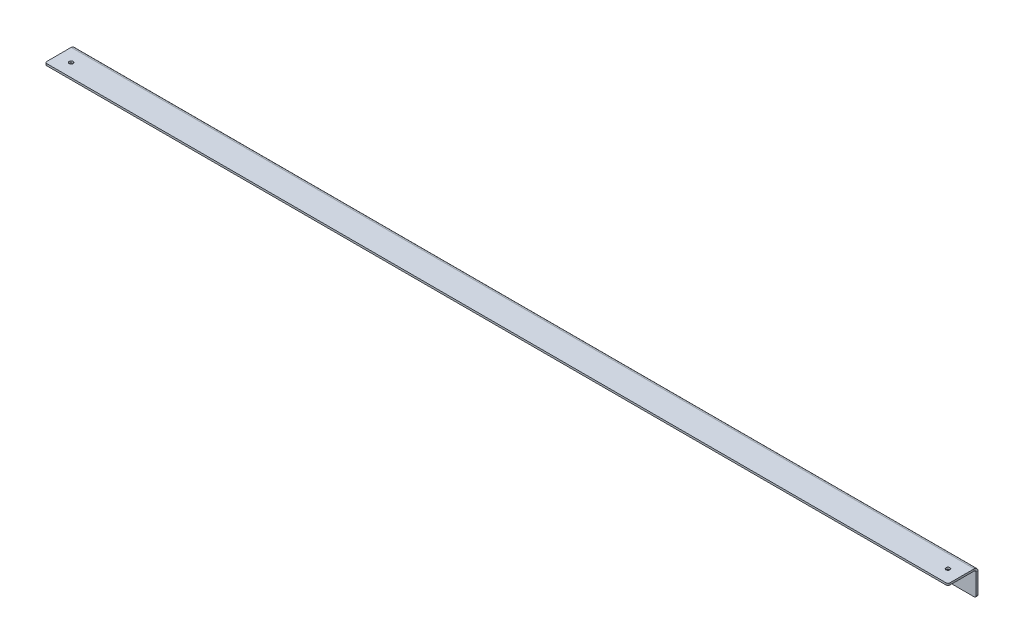
ISO-10303-21;
HEADER;
FILE_DESCRIPTION(('STEP AP214'),'2;1');
FILE_NAME('part.step','',(''),(''),'','','');
FILE_SCHEMA(('AUTOMOTIVE_DESIGN { 1 0 10303 214 1 1 1 1 }'));
ENDSEC;
DATA;
#1=APPLICATION_CONTEXT('core data for automotive mechanical design processes');
#2=APPLICATION_PROTOCOL_DEFINITION('international standard','automotive_design',2000,#1);
#3=PRODUCT_CONTEXT('',#1,'mechanical');
#4=PRODUCT('Part','Part','',(#3));
#5=PRODUCT_RELATED_PRODUCT_CATEGORY('part','',(#4));
#6=PRODUCT_DEFINITION_FORMATION('','',#4);
#7=PRODUCT_DEFINITION_CONTEXT('part definition',#1,'design');
#8=PRODUCT_DEFINITION('design','',#6,#7);
#9=PRODUCT_DEFINITION_SHAPE('','',#8);
#10=(LENGTH_UNIT() NAMED_UNIT(*) SI_UNIT(.MILLI.,.METRE.));
#11=(NAMED_UNIT(*) PLANE_ANGLE_UNIT() SI_UNIT($,.RADIAN.));
#12=(NAMED_UNIT(*) SI_UNIT($,.STERADIAN.) SOLID_ANGLE_UNIT());
#13=UNCERTAINTY_MEASURE_WITH_UNIT(LENGTH_MEASURE(1.E-05),#10,'distance_accuracy_value','');
#14=(GEOMETRIC_REPRESENTATION_CONTEXT(3) GLOBAL_UNCERTAINTY_ASSIGNED_CONTEXT((#13)) GLOBAL_UNIT_ASSIGNED_CONTEXT((#10,
#11,#12)) REPRESENTATION_CONTEXT('',''));
#15=CARTESIAN_POINT('',(0.,0.,0.));
#16=DIRECTION('',(0.,0.,1.));
#17=DIRECTION('',(1.,0.,0.));
#18=AXIS2_PLACEMENT_3D('',#15,#16,#17);
#19=CARTESIAN_POINT('',(0.,-3.2639,0.));
#20=DIRECTION('',(-1.,0.,0.));
#21=DIRECTION('',(0.,0.,1.));
#22=AXIS2_PLACEMENT_3D('',#19,#20,#21);
#23=PLANE('',#22);
#24=DIRECTION('',(0.,0.,1.));
#25=VECTOR('',#24,1.);
#26=CARTESIAN_POINT('',(0.,-3.2639,0.));
#27=LINE('',#26,#25);
#28=CARTESIAN_POINT('',(0.,-3.26390000000002,-44.45));
#29=VERTEX_POINT('',#28);
#30=CARTESIAN_POINT('',(0.,-3.2639,-3.175));
#31=VERTEX_POINT('',#30);
#32=EDGE_CURVE('E216',#29,#31,#27,.T.);
#33=ORIENTED_EDGE('',*,*,#32,.T.);
#34=DIRECTION('',(0.,1.,0.));
#35=VECTOR('',#34,1.);
#36=CARTESIAN_POINT('',(0.,-3.2639,-3.175));
#37=LINE('',#36,#35);
#38=CARTESIAN_POINT('',(0.,0.,-3.175));
#39=VERTEX_POINT('',#38);
#40=EDGE_CURVE('E264',#31,#39,#37,.T.);
#41=ORIENTED_EDGE('',*,*,#40,.T.);
#42=DIRECTION('',(0.,0.,1.));
#43=VECTOR('',#42,1.);
#44=CARTESIAN_POINT('',(0.,0.,0.));
#45=LINE('',#44,#43);
#46=CARTESIAN_POINT('',(0.,0.,-44.45));
#47=VERTEX_POINT('',#46);
#48=EDGE_CURVE('E209',#47,#39,#45,.T.);
#49=ORIENTED_EDGE('',*,*,#48,.F.);
#50=DIRECTION('',(0.,1.,0.));
#51=VECTOR('',#50,1.);
#52=CARTESIAN_POINT('',(0.,-3.2639,-44.45));
#53=LINE('',#52,#51);
#54=EDGE_CURVE('E242',#29,#47,#53,.T.);
#55=ORIENTED_EDGE('',*,*,#54,.F.);
#56=EDGE_LOOP('',(#33,#41,#49,#55));
#57=FACE_BOUND('',#56,.T.);
#58=ADVANCED_FACE('F60',(#57),#23,.T.);
#59=CARTESIAN_POINT('',(1530.35,-3.2639,0.));
#60=DIRECTION('',(1.,0.,0.));
#61=DIRECTION('',(0.,0.,-1.));
#62=AXIS2_PLACEMENT_3D('',#59,#60,#61);
#63=PLANE('',#62);
#64=DIRECTION('',(0.,0.,-1.));
#65=VECTOR('',#64,1.);
#66=CARTESIAN_POINT('',(1530.35,0.,0.));
#67=LINE('',#66,#65);
#68=CARTESIAN_POINT('',(1530.35,0.,-3.175));
#69=VERTEX_POINT('',#68);
#70=CARTESIAN_POINT('',(1530.35,0.,-44.45));
#71=VERTEX_POINT('',#70);
#72=EDGE_CURVE('E237',#69,#71,#67,.T.);
#73=ORIENTED_EDGE('',*,*,#72,.F.);
#74=DIRECTION('',(0.,1.,0.));
#75=VECTOR('',#74,1.);
#76=CARTESIAN_POINT('',(1530.35,-3.2639,-3.175));
#77=LINE('',#76,#75);
#78=CARTESIAN_POINT('',(1530.35,-3.2639,-3.175));
#79=VERTEX_POINT('',#78);
#80=EDGE_CURVE('E13',#69,#79,#77,.F.);
#81=ORIENTED_EDGE('',*,*,#80,.T.);
#82=DIRECTION('',(0.,0.,-1.));
#83=VECTOR('',#82,1.);
#84=CARTESIAN_POINT('',(1530.35,-3.2639,0.));
#85=LINE('',#84,#83);
#86=CARTESIAN_POINT('',(1530.35,-3.26390000000002,-44.45));
#87=VERTEX_POINT('',#86);
#88=EDGE_CURVE('E223',#79,#87,#85,.T.);
#89=ORIENTED_EDGE('',*,*,#88,.T.);
#90=DIRECTION('',(0.,1.,0.));
#91=VECTOR('',#90,1.);
#92=CARTESIAN_POINT('',(1530.35,-3.2639,-44.45));
#93=LINE('',#92,#91);
#94=EDGE_CURVE('E229',#87,#71,#93,.T.);
#95=ORIENTED_EDGE('',*,*,#94,.T.);
#96=EDGE_LOOP('',(#73,#81,#89,#95));
#97=FACE_BOUND('',#96,.T.);
#98=ADVANCED_FACE('F296',(#97),#63,.T.);
#99=CARTESIAN_POINT('',(0.,-3.2639,0.));
#100=DIRECTION('',(0.,0.,1.));
#101=DIRECTION('',(1.,0.,0.));
#102=AXIS2_PLACEMENT_3D('',#99,#100,#101);
#103=PLANE('',#102);
#104=DIRECTION('',(1.,0.,0.));
#105=VECTOR('',#104,1.);
#106=CARTESIAN_POINT('',(0.,0.,0.));
#107=LINE('',#106,#105);
#108=CARTESIAN_POINT('',(3.175,0.,0.));
#109=VERTEX_POINT('',#108);
#110=CARTESIAN_POINT('',(1527.175,0.,0.));
#111=VERTEX_POINT('',#110);
#112=EDGE_CURVE('E233',#109,#111,#107,.T.);
#113=ORIENTED_EDGE('',*,*,#112,.F.);
#114=DIRECTION('',(0.,1.,0.));
#115=VECTOR('',#114,1.);
#116=CARTESIAN_POINT('',(3.175,-3.2639,0.));
#117=LINE('',#116,#115);
#118=CARTESIAN_POINT('',(3.175,-3.2639,0.));
#119=VERTEX_POINT('',#118);
#120=EDGE_CURVE('E274',#109,#119,#117,.F.);
#121=ORIENTED_EDGE('',*,*,#120,.T.);
#122=DIRECTION('',(1.,0.,0.));
#123=VECTOR('',#122,1.);
#124=CARTESIAN_POINT('',(0.,-3.2639,0.));
#125=LINE('',#124,#123);
#126=CARTESIAN_POINT('',(1527.175,-3.2639,0.));
#127=VERTEX_POINT('',#126);
#128=EDGE_CURVE('E220',#119,#127,#125,.T.);
#129=ORIENTED_EDGE('',*,*,#128,.T.);
#130=DIRECTION('',(0.,1.,0.));
#131=VECTOR('',#130,1.);
#132=CARTESIAN_POINT('',(1527.175,-3.2639,0.));
#133=LINE('',#132,#131);
#134=EDGE_CURVE('E271',#127,#111,#133,.T.);
#135=ORIENTED_EDGE('',*,*,#134,.T.);
#136=EDGE_LOOP('',(#113,#121,#129,#135));
#137=FACE_BOUND('',#136,.T.);
#138=ADVANCED_FACE('F293',(#137),#103,.T.);
#139=CARTESIAN_POINT('',(0.,-3.2639,0.));
#140=DIRECTION('',(0.,-1.,0.));
#141=DIRECTION('',(0.,0.,-1.));
#142=AXIS2_PLACEMENT_3D('',#139,#140,#141);
#143=PLANE('',#142);
#144=CARTESIAN_POINT('',(22.2249999999999,-3.2639,-22.225));
#145=DIRECTION('',(0.,-1.,0.));
#146=DIRECTION('',(0.,0.,-1.));
#147=AXIS2_PLACEMENT_3D('',#144,#145,#146);
#148=CIRCLE('',#147,3.37819999999999);
#149=CARTESIAN_POINT('',(22.2249999999999,-3.2639,-25.6032));
#150=VERTEX_POINT('',#149);
#151=EDGE_CURVE('E335',#150,#150,#148,.T.);
#152=ORIENTED_EDGE('',*,*,#151,.F.);
#153=EDGE_LOOP('',(#152));
#154=FACE_BOUND('',#153,.T.);
#155=CARTESIAN_POINT('',(1508.125,-3.2639,-22.225));
#156=DIRECTION('',(0.,-1.,0.));
#157=DIRECTION('',(0.,0.,-1.));
#158=AXIS2_PLACEMENT_3D('',#155,#156,#157);
#159=CIRCLE('',#158,3.3782);
#160=CARTESIAN_POINT('',(1508.125,-3.2639,-25.6032));
#161=VERTEX_POINT('',#160);
#162=EDGE_CURVE('E207',#161,#161,#159,.T.);
#163=ORIENTED_EDGE('',*,*,#162,.F.);
#164=EDGE_LOOP('',(#163));
#165=FACE_BOUND('',#164,.T.);
#166=ORIENTED_EDGE('',*,*,#128,.F.);
#167=CARTESIAN_POINT('',(3.175,-3.2639,-3.175));
#168=DIRECTION('',(0.,-1.,0.));
#169=DIRECTION('',(0.,0.,-1.));
#170=AXIS2_PLACEMENT_3D('',#167,#168,#169);
#171=CIRCLE('',#170,3.175);
#172=EDGE_CURVE('E277',#119,#31,#171,.T.);
#173=ORIENTED_EDGE('',*,*,#172,.T.);
#174=ORIENTED_EDGE('',*,*,#32,.F.);
#175=DIRECTION('',(-1.,0.,0.));
#176=VECTOR('',#175,1.);
#177=CARTESIAN_POINT('',(0.,-3.2639,-44.45));
#178=LINE('',#177,#176);
#179=EDGE_CURVE('E226',#87,#29,#178,.T.);
#180=ORIENTED_EDGE('',*,*,#179,.F.);
#181=ORIENTED_EDGE('',*,*,#88,.F.);
#182=CARTESIAN_POINT('',(1527.175,-3.2639,-3.175));
#183=DIRECTION('',(0.,-1.,0.));
#184=DIRECTION('',(0.,0.,-1.));
#185=AXIS2_PLACEMENT_3D('',#182,#183,#184);
#186=CIRCLE('',#185,3.175);
#187=EDGE_CURVE('E80',#79,#127,#186,.T.);
#188=ORIENTED_EDGE('',*,*,#187,.T.);
#189=EDGE_LOOP('',(#166,#173,#174,#180,#181,#188));
#190=FACE_BOUND('',#189,.T.);
#191=ADVANCED_FACE('F280',(#154,#165,#190),#143,.T.);
#192=CARTESIAN_POINT('',(0.,0.,0.));
#193=DIRECTION('',(0.,-1.,0.));
#194=DIRECTION('',(0.,0.,-1.));
#195=AXIS2_PLACEMENT_3D('',#192,#193,#194);
#196=PLANE('',#195);
#197=CARTESIAN_POINT('',(22.2249999999999,0.,-22.225));
#198=DIRECTION('',(0.,1.,0.));
#199=DIRECTION('',(0.,0.,1.));
#200=AXIS2_PLACEMENT_3D('',#197,#198,#199);
#201=CIRCLE('',#200,3.37819999999999);
#202=CARTESIAN_POINT('',(22.2249999999999,0.,-18.8468));
#203=VERTEX_POINT('',#202);
#204=EDGE_CURVE('E339',#203,#203,#201,.T.);
#205=ORIENTED_EDGE('',*,*,#204,.F.);
#206=EDGE_LOOP('',(#205));
#207=FACE_BOUND('',#206,.T.);
#208=CARTESIAN_POINT('',(1508.125,0.,-22.225));
#209=DIRECTION('',(0.,1.,0.));
#210=DIRECTION('',(0.,0.,1.));
#211=AXIS2_PLACEMENT_3D('',#208,#209,#210);
#212=CIRCLE('',#211,3.3782);
#213=CARTESIAN_POINT('',(1508.125,0.,-18.8468));
#214=VERTEX_POINT('',#213);
#215=EDGE_CURVE('E331',#214,#214,#212,.T.);
#216=ORIENTED_EDGE('',*,*,#215,.F.);
#217=EDGE_LOOP('',(#216));
#218=FACE_BOUND('',#217,.T.);
#219=ORIENTED_EDGE('',*,*,#48,.T.);
#220=CARTESIAN_POINT('',(3.175,0.,-3.175));
#221=DIRECTION('',(0.,-1.,0.));
#222=DIRECTION('',(0.,0.,-1.));
#223=AXIS2_PLACEMENT_3D('',#220,#221,#222);
#224=CIRCLE('',#223,3.175);
#225=EDGE_CURVE('E269',#39,#109,#224,.F.);
#226=ORIENTED_EDGE('',*,*,#225,.T.);
#227=ORIENTED_EDGE('',*,*,#112,.T.);
#228=CARTESIAN_POINT('',(1527.175,0.,-3.175));
#229=DIRECTION('',(0.,-1.,0.));
#230=DIRECTION('',(0.,0.,-1.));
#231=AXIS2_PLACEMENT_3D('',#228,#229,#230);
#232=CIRCLE('',#231,3.175);
#233=EDGE_CURVE('E267',#111,#69,#232,.F.);
#234=ORIENTED_EDGE('',*,*,#233,.T.);
#235=ORIENTED_EDGE('',*,*,#72,.T.);
#236=DIRECTION('',(-1.,0.,0.));
#237=VECTOR('',#236,1.);
#238=CARTESIAN_POINT('',(0.,0.,-44.45));
#239=LINE('',#238,#237);
#240=EDGE_CURVE('E171',#71,#47,#239,.T.);
#241=ORIENTED_EDGE('',*,*,#240,.T.);
#242=EDGE_LOOP('',(#219,#226,#227,#234,#235,#241));
#243=FACE_BOUND('',#242,.T.);
#244=ADVANCED_FACE('F291',(#207,#218,#243),#196,.F.);
#245=CARTESIAN_POINT('',(0.,-6.43890000000002,-44.45));
#246=DIRECTION('',(-1.,0.,0.));
#247=DIRECTION('',(0.,0.,1.));
#248=AXIS2_PLACEMENT_3D('',#245,#246,#247);
#249=PLANE('',#248);
#250=DIRECTION('',(0.,0.,-1.));
#251=VECTOR('',#250,1.);
#252=CARTESIAN_POINT('',(0.,-6.43889999999998,-50.8888999999999));
#253=LINE('',#252,#251);
#254=CARTESIAN_POINT('',(0.,-6.43890000000001,-47.625));
#255=VERTEX_POINT('',#254);
#256=CARTESIAN_POINT('',(0.,-6.43889999999999,-50.8889));
#257=VERTEX_POINT('',#256);
#258=EDGE_CURVE('E203',#255,#257,#253,.T.);
#259=ORIENTED_EDGE('',*,*,#258,.F.);
#260=CARTESIAN_POINT('',(0.,-6.43890000000002,-44.45));
#261=DIRECTION('',(1.,0.,0.));
#262=DIRECTION('',(0.,0.,-1.));
#263=AXIS2_PLACEMENT_3D('',#260,#261,#262);
#264=CIRCLE('',#263,3.175);
#265=EDGE_CURVE('E177',#29,#255,#264,.F.);
#266=ORIENTED_EDGE('',*,*,#265,.F.);
#267=ORIENTED_EDGE('',*,*,#54,.T.);
#268=CARTESIAN_POINT('',(0.,-6.43890000000002,-44.45));
#269=DIRECTION('',(1.,0.,0.));
#270=DIRECTION('',(0.,0.,-1.));
#271=AXIS2_PLACEMENT_3D('',#268,#269,#270);
#272=CIRCLE('',#271,6.4389);
#273=EDGE_CURVE('E176',#47,#257,#272,.F.);
#274=ORIENTED_EDGE('',*,*,#273,.T.);
#275=EDGE_LOOP('',(#259,#266,#267,#274));
#276=FACE_BOUND('',#275,.T.);
#277=ADVANCED_FACE('F348',(#276),#249,.T.);
#278=CARTESIAN_POINT('',(1530.35,-6.43890000000002,-44.45));
#279=DIRECTION('',(-1.,0.,0.));
#280=DIRECTION('',(0.,0.,1.));
#281=AXIS2_PLACEMENT_3D('',#278,#279,#280);
#282=PLANE('',#281);
#283=CARTESIAN_POINT('',(1530.35,-6.43890000000002,-44.45));
#284=DIRECTION('',(1.,0.,0.));
#285=DIRECTION('',(0.,0.,-1.));
#286=AXIS2_PLACEMENT_3D('',#283,#284,#285);
#287=CIRCLE('',#286,3.175);
#288=CARTESIAN_POINT('',(1530.35,-6.43890000000001,-47.625));
#289=VERTEX_POINT('',#288);
#290=EDGE_CURVE('E160',#289,#87,#287,.T.);
#291=ORIENTED_EDGE('',*,*,#290,.F.);
#292=DIRECTION('',(0.,0.,-1.));
#293=VECTOR('',#292,1.);
#294=CARTESIAN_POINT('',(1530.35,-6.4389,-47.625));
#295=LINE('',#294,#293);
#296=CARTESIAN_POINT('',(1530.35,-6.43889999999997,-50.8889));
#297=VERTEX_POINT('',#296);
#298=EDGE_CURVE('E154',#289,#297,#295,.T.);
#299=ORIENTED_EDGE('',*,*,#298,.T.);
#300=CARTESIAN_POINT('',(1530.35,-6.43890000000002,-44.45));
#301=DIRECTION('',(1.,0.,0.));
#302=DIRECTION('',(0.,0.,-1.));
#303=AXIS2_PLACEMENT_3D('',#300,#301,#302);
#304=CIRCLE('',#303,6.4389);
#305=EDGE_CURVE('E166',#297,#71,#304,.T.);
#306=ORIENTED_EDGE('',*,*,#305,.T.);
#307=ORIENTED_EDGE('',*,*,#94,.F.);
#308=EDGE_LOOP('',(#291,#299,#306,#307));
#309=FACE_BOUND('',#308,.T.);
#310=ADVANCED_FACE('F180',(#309),#282,.F.);
#311=CARTESIAN_POINT('',(1530.35,-6.43890000000002,-44.45));
#312=DIRECTION('',(1.,0.,0.));
#313=DIRECTION('',(0.,0.,-1.));
#314=AXIS2_PLACEMENT_3D('',#311,#312,#313);
#315=CYLINDRICAL_SURFACE('',#314,6.4389);
#316=ORIENTED_EDGE('',*,*,#240,.F.);
#317=ORIENTED_EDGE('',*,*,#305,.F.);
#318=DIRECTION('',(1.,0.,0.));
#319=VECTOR('',#318,1.);
#320=CARTESIAN_POINT('',(0.,-6.43889999999997,-50.8889));
#321=LINE('',#320,#319);
#322=EDGE_CURVE('E168',#257,#297,#321,.T.);
#323=ORIENTED_EDGE('',*,*,#322,.F.);
#324=ORIENTED_EDGE('',*,*,#273,.F.);
#325=EDGE_LOOP('',(#316,#317,#323,#324));
#326=FACE_BOUND('',#325,.T.);
#327=ADVANCED_FACE('F167',(#326),#315,.T.);
#328=CARTESIAN_POINT('',(1530.35,-6.43890000000002,-44.45));
#329=DIRECTION('',(1.,0.,0.));
#330=DIRECTION('',(0.,0.,-1.));
#331=AXIS2_PLACEMENT_3D('',#328,#329,#330);
#332=CYLINDRICAL_SURFACE('',#331,3.175);
#333=ORIENTED_EDGE('',*,*,#179,.T.);
#334=ORIENTED_EDGE('',*,*,#265,.T.);
#335=DIRECTION('',(-1.,0.,0.));
#336=VECTOR('',#335,1.);
#337=CARTESIAN_POINT('',(0.,-6.43889999999999,-47.625));
#338=LINE('',#337,#336);
#339=EDGE_CURVE('E183',#255,#289,#338,.F.);
#340=ORIENTED_EDGE('',*,*,#339,.T.);
#341=ORIENTED_EDGE('',*,*,#290,.T.);
#342=EDGE_LOOP('',(#333,#334,#340,#341));
#343=FACE_BOUND('',#342,.T.);
#344=ADVANCED_FACE('F298',(#343),#332,.F.);
#345=CARTESIAN_POINT('',(1530.35,-3.26389999999999,-50.8889));
#346=DIRECTION('',(1.,0.,0.));
#347=DIRECTION('',(0.,0.,-1.));
#348=AXIS2_PLACEMENT_3D('',#345,#346,#347);
#349=PLANE('',#348);
#350=DIRECTION('',(0.,-1.,0.));
#351=VECTOR('',#350,1.);
#352=CARTESIAN_POINT('',(1530.35,1.57264477933142E-13,-47.625));
#353=LINE('',#352,#351);
#354=CARTESIAN_POINT('',(1530.35,-41.275,-47.6250000000001));
#355=VERTEX_POINT('',#354);
#356=EDGE_CURVE('E304',#355,#289,#353,.F.);
#357=ORIENTED_EDGE('',*,*,#356,.F.);
#358=DIRECTION('',(0.,0.,1.));
#359=VECTOR('',#358,1.);
#360=CARTESIAN_POINT('',(1530.35,-41.275,-50.8889000000001));
#361=LINE('',#360,#359);
#362=CARTESIAN_POINT('',(1530.35,-41.275,-50.8889000000001));
#363=VERTEX_POINT('',#362);
#364=EDGE_CURVE('E68',#355,#363,#361,.F.);
#365=ORIENTED_EDGE('',*,*,#364,.T.);
#366=DIRECTION('',(0.,1.,0.));
#367=VECTOR('',#366,1.);
#368=CARTESIAN_POINT('',(1530.35,-3.26389999999999,-50.8889));
#369=LINE('',#368,#367);
#370=EDGE_CURVE('E149',#363,#297,#369,.T.);
#371=ORIENTED_EDGE('',*,*,#370,.T.);
#372=ORIENTED_EDGE('',*,*,#298,.F.);
#373=EDGE_LOOP('',(#357,#365,#371,#372));
#374=FACE_BOUND('',#373,.T.);
#375=ADVANCED_FACE('F152',(#374),#349,.T.);
#376=CARTESIAN_POINT('',(0.,-44.45,-50.8889000000001));
#377=DIRECTION('',(-1.,0.,0.));
#378=DIRECTION('',(0.,0.,1.));
#379=AXIS2_PLACEMENT_3D('',#376,#377,#378);
#380=PLANE('',#379);
#381=DIRECTION('',(0.,-1.,0.));
#382=VECTOR('',#381,1.);
#383=CARTESIAN_POINT('',(0.,-44.45,-50.8889000000001));
#384=LINE('',#383,#382);
#385=CARTESIAN_POINT('',(0.,-41.275,-50.8889000000001));
#386=VERTEX_POINT('',#385);
#387=EDGE_CURVE('E189',#257,#386,#384,.T.);
#388=ORIENTED_EDGE('',*,*,#387,.T.);
#389=DIRECTION('',(0.,0.,1.));
#390=VECTOR('',#389,1.);
#391=CARTESIAN_POINT('',(0.,-41.275,-50.8889000000001));
#392=LINE('',#391,#390);
#393=CARTESIAN_POINT('',(0.,-41.275,-47.6250000000001));
#394=VERTEX_POINT('',#393);
#395=EDGE_CURVE('E246',#386,#394,#392,.T.);
#396=ORIENTED_EDGE('',*,*,#395,.T.);
#397=DIRECTION('',(0.,1.,0.));
#398=VECTOR('',#397,1.);
#399=CARTESIAN_POINT('',(0.,1.57264477933142E-13,-47.625));
#400=LINE('',#399,#398);
#401=EDGE_CURVE('E191',#255,#394,#400,.F.);
#402=ORIENTED_EDGE('',*,*,#401,.F.);
#403=ORIENTED_EDGE('',*,*,#258,.T.);
#404=EDGE_LOOP('',(#388,#396,#402,#403));
#405=FACE_BOUND('',#404,.T.);
#406=ADVANCED_FACE('F306',(#405),#380,.T.);
#407=CARTESIAN_POINT('',(0.,1.68660323874993E-13,-50.8889));
#408=DIRECTION('',(0.,0.,-1.));
#409=DIRECTION('',(0.,1.,0.));
#410=AXIS2_PLACEMENT_3D('',#407,#408,#409);
#411=PLANE('',#410);
#412=DIRECTION('',(1.,0.,0.));
#413=VECTOR('',#412,1.);
#414=CARTESIAN_POINT('',(1530.35,-44.45,-50.8889000000001));
#415=LINE('',#414,#413);
#416=CARTESIAN_POINT('',(3.17499999999993,-44.45,-50.8889000000001));
#417=VERTEX_POINT('',#416);
#418=CARTESIAN_POINT('',(1527.175,-44.45,-50.8889000000001));
#419=VERTEX_POINT('',#418);
#420=EDGE_CURVE('E161',#417,#419,#415,.T.);
#421=ORIENTED_EDGE('',*,*,#420,.F.);
#422=CARTESIAN_POINT('',(3.175,-41.275,-50.8889000000001));
#423=DIRECTION('',(0.,0.,-1.));
#424=DIRECTION('',(0.,1.,0.));
#425=AXIS2_PLACEMENT_3D('',#422,#423,#424);
#426=CIRCLE('',#425,3.175);
#427=EDGE_CURVE('E262',#417,#386,#426,.T.);
#428=ORIENTED_EDGE('',*,*,#427,.T.);
#429=ORIENTED_EDGE('',*,*,#387,.F.);
#430=ORIENTED_EDGE('',*,*,#322,.T.);
#431=ORIENTED_EDGE('',*,*,#370,.F.);
#432=CARTESIAN_POINT('',(1527.175,-41.275,-50.8889000000001));
#433=DIRECTION('',(0.,0.,-1.));
#434=DIRECTION('',(0.,1.,0.));
#435=AXIS2_PLACEMENT_3D('',#432,#433,#434);
#436=CIRCLE('',#435,3.175);
#437=EDGE_CURVE('E260',#363,#419,#436,.T.);
#438=ORIENTED_EDGE('',*,*,#437,.T.);
#439=EDGE_LOOP('',(#421,#428,#429,#430,#431,#438));
#440=FACE_BOUND('',#439,.T.);
#441=ADVANCED_FACE('F187',(#440),#411,.T.);
#442=CARTESIAN_POINT('',(0.,1.57264477933142E-13,-47.625));
#443=DIRECTION('',(0.,0.,-1.));
#444=DIRECTION('',(0.,1.,0.));
#445=AXIS2_PLACEMENT_3D('',#442,#443,#444);
#446=PLANE('',#445);
#447=ORIENTED_EDGE('',*,*,#401,.T.);
#448=CARTESIAN_POINT('',(3.175,-41.275,-47.6250000000001));
#449=DIRECTION('',(0.,0.,-1.));
#450=DIRECTION('',(0.,1.,0.));
#451=AXIS2_PLACEMENT_3D('',#448,#449,#450);
#452=CIRCLE('',#451,3.175);
#453=CARTESIAN_POINT('',(3.175,-44.45,-47.6250000000001));
#454=VERTEX_POINT('',#453);
#455=EDGE_CURVE('E253',#394,#454,#452,.F.);
#456=ORIENTED_EDGE('',*,*,#455,.T.);
#457=DIRECTION('',(-1.,0.,0.));
#458=VECTOR('',#457,1.);
#459=CARTESIAN_POINT('',(0.,-44.45,-47.6250000000001));
#460=LINE('',#459,#458);
#461=CARTESIAN_POINT('',(1527.175,-44.45,-47.6250000000001));
#462=VERTEX_POINT('',#461);
#463=EDGE_CURVE('E196',#454,#462,#460,.F.);
#464=ORIENTED_EDGE('',*,*,#463,.T.);
#465=CARTESIAN_POINT('',(1527.175,-41.275,-47.6250000000001));
#466=DIRECTION('',(0.,0.,-1.));
#467=DIRECTION('',(0.,1.,0.));
#468=AXIS2_PLACEMENT_3D('',#465,#466,#467);
#469=CIRCLE('',#468,3.175);
#470=EDGE_CURVE('E251',#462,#355,#469,.F.);
#471=ORIENTED_EDGE('',*,*,#470,.T.);
#472=ORIENTED_EDGE('',*,*,#356,.T.);
#473=ORIENTED_EDGE('',*,*,#339,.F.);
#474=EDGE_LOOP('',(#447,#456,#464,#471,#472,#473));
#475=FACE_BOUND('',#474,.T.);
#476=ADVANCED_FACE('F303',(#475),#446,.F.);
#477=CARTESIAN_POINT('',(1530.35,-44.45,-50.8889000000001));
#478=DIRECTION('',(0.,-1.,0.));
#479=DIRECTION('',(0.,0.,-1.));
#480=AXIS2_PLACEMENT_3D('',#477,#478,#479);
#481=PLANE('',#480);
#482=ORIENTED_EDGE('',*,*,#463,.F.);
#483=DIRECTION('',(0.,0.,1.));
#484=VECTOR('',#483,1.);
#485=CARTESIAN_POINT('',(3.17499999999993,-44.45,-50.8889000000001));
#486=LINE('',#485,#484);
#487=EDGE_CURVE('E258',#454,#417,#486,.F.);
#488=ORIENTED_EDGE('',*,*,#487,.T.);
#489=ORIENTED_EDGE('',*,*,#420,.T.);
#490=DIRECTION('',(0.,0.,1.));
#491=VECTOR('',#490,1.);
#492=CARTESIAN_POINT('',(1527.175,-44.45,-50.8889000000001));
#493=LINE('',#492,#491);
#494=EDGE_CURVE('E255',#419,#462,#493,.T.);
#495=ORIENTED_EDGE('',*,*,#494,.T.);
#496=EDGE_LOOP('',(#482,#488,#489,#495));
#497=FACE_BOUND('',#496,.T.);
#498=ADVANCED_FACE('F315',(#497),#481,.T.);
#499=CARTESIAN_POINT('',(1508.125,0.,-22.225));
#500=DIRECTION('',(0.,1.,0.));
#501=DIRECTION('',(0.,0.,1.));
#502=AXIS2_PLACEMENT_3D('',#499,#500,#501);
#503=CYLINDRICAL_SURFACE('',#502,3.3782);
#504=ORIENTED_EDGE('',*,*,#162,.T.);
#505=EDGE_LOOP('',(#504));
#506=FACE_BOUND('',#505,.T.);
#507=ORIENTED_EDGE('',*,*,#215,.T.);
#508=EDGE_LOOP('',(#507));
#509=FACE_BOUND('',#508,.T.);
#510=ADVANCED_FACE('F352',(#506,#509),#503,.F.);
#511=CARTESIAN_POINT('',(22.2249999999999,0.,-22.225));
#512=DIRECTION('',(0.,1.,0.));
#513=DIRECTION('',(0.,0.,1.));
#514=AXIS2_PLACEMENT_3D('',#511,#512,#513);
#515=CYLINDRICAL_SURFACE('',#514,3.37819999999999);
#516=ORIENTED_EDGE('',*,*,#151,.T.);
#517=EDGE_LOOP('',(#516));
#518=FACE_BOUND('',#517,.T.);
#519=ORIENTED_EDGE('',*,*,#204,.T.);
#520=EDGE_LOOP('',(#519));
#521=FACE_BOUND('',#520,.T.);
#522=ADVANCED_FACE('F344',(#518,#521),#515,.F.);
#523=CARTESIAN_POINT('',(3.175,-41.275,-50.8889000000001));
#524=DIRECTION('',(0.,0.,1.));
#525=DIRECTION('',(0.,-1.,0.));
#526=AXIS2_PLACEMENT_3D('',#523,#524,#525);
#527=CYLINDRICAL_SURFACE('',#526,3.175);
#528=ORIENTED_EDGE('',*,*,#427,.F.);
#529=ORIENTED_EDGE('',*,*,#487,.F.);
#530=ORIENTED_EDGE('',*,*,#455,.F.);
#531=ORIENTED_EDGE('',*,*,#395,.F.);
#532=EDGE_LOOP('',(#528,#529,#530,#531));
#533=FACE_BOUND('',#532,.T.);
#534=ADVANCED_FACE('F310',(#533),#527,.T.);
#535=CARTESIAN_POINT('',(3.175,-3.2639,-3.175));
#536=DIRECTION('',(0.,1.,0.));
#537=DIRECTION('',(0.,0.,1.));
#538=AXIS2_PLACEMENT_3D('',#535,#536,#537);
#539=CYLINDRICAL_SURFACE('',#538,3.175);
#540=ORIENTED_EDGE('',*,*,#172,.F.);
#541=ORIENTED_EDGE('',*,*,#120,.F.);
#542=ORIENTED_EDGE('',*,*,#225,.F.);
#543=ORIENTED_EDGE('',*,*,#40,.F.);
#544=EDGE_LOOP('',(#540,#541,#542,#543));
#545=FACE_BOUND('',#544,.T.);
#546=ADVANCED_FACE('F288',(#545),#539,.T.);
#547=CARTESIAN_POINT('',(1527.175,-41.275,-50.8889000000001));
#548=DIRECTION('',(0.,0.,1.));
#549=DIRECTION('',(0.,-1.,0.));
#550=AXIS2_PLACEMENT_3D('',#547,#548,#549);
#551=CYLINDRICAL_SURFACE('',#550,3.175);
#552=ORIENTED_EDGE('',*,*,#437,.F.);
#553=ORIENTED_EDGE('',*,*,#364,.F.);
#554=ORIENTED_EDGE('',*,*,#470,.F.);
#555=ORIENTED_EDGE('',*,*,#494,.F.);
#556=EDGE_LOOP('',(#552,#553,#554,#555));
#557=FACE_BOUND('',#556,.T.);
#558=ADVANCED_FACE('F377',(#557),#551,.T.);
#559=CARTESIAN_POINT('',(1527.175,-3.2639,-3.175));
#560=DIRECTION('',(0.,1.,0.));
#561=DIRECTION('',(0.,0.,1.));
#562=AXIS2_PLACEMENT_3D('',#559,#560,#561);
#563=CYLINDRICAL_SURFACE('',#562,3.175);
#564=ORIENTED_EDGE('',*,*,#187,.F.);
#565=ORIENTED_EDGE('',*,*,#80,.F.);
#566=ORIENTED_EDGE('',*,*,#233,.F.);
#567=ORIENTED_EDGE('',*,*,#134,.F.);
#568=EDGE_LOOP('',(#564,#565,#566,#567));
#569=FACE_BOUND('',#568,.T.);
#570=ADVANCED_FACE('F62',(#569),#563,.T.);
#571=CLOSED_SHELL('',(#58,#98,#138,#191,#244,#277,#310,#327,#344,#375,#406,#441,#476,#498,#510,
#522,#534,#546,#558,#570));
#572=MANIFOLD_SOLID_BREP('B2',#571);
#573=ADVANCED_BREP_SHAPE_REPRESENTATION('',(#18,#572),#14);
#574=SHAPE_DEFINITION_REPRESENTATION(#9,#573);
ENDSEC;
END-ISO-10303-21;
